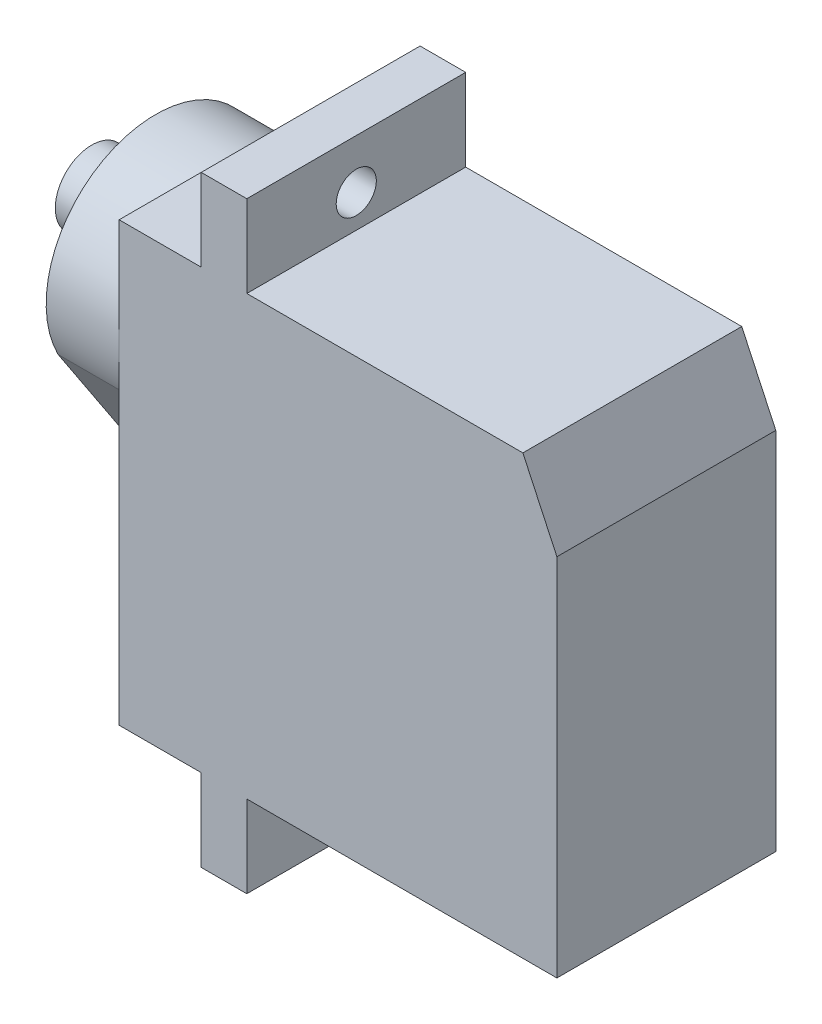
ISO-10303-21;
HEADER;
FILE_DESCRIPTION(('STEP AP214'),'2;1');
FILE_NAME('part.step','',(''),(''),'','','');
FILE_SCHEMA(('AUTOMOTIVE_DESIGN { 1 0 10303 214 1 1 1 1 }'));
ENDSEC;
DATA;
#1=APPLICATION_CONTEXT('core data for automotive mechanical design processes');
#2=APPLICATION_PROTOCOL_DEFINITION('international standard','automotive_design',2000,#1);
#3=PRODUCT_CONTEXT('',#1,'mechanical');
#4=PRODUCT('Part','Part','',(#3));
#5=PRODUCT_RELATED_PRODUCT_CATEGORY('part','',(#4));
#6=PRODUCT_DEFINITION_FORMATION('','',#4);
#7=PRODUCT_DEFINITION_CONTEXT('part definition',#1,'design');
#8=PRODUCT_DEFINITION('design','',#6,#7);
#9=PRODUCT_DEFINITION_SHAPE('','',#8);
#10=(LENGTH_UNIT() NAMED_UNIT(*) SI_UNIT(.MILLI.,.METRE.));
#11=(NAMED_UNIT(*) PLANE_ANGLE_UNIT() SI_UNIT($,.RADIAN.));
#12=(NAMED_UNIT(*) SI_UNIT($,.STERADIAN.) SOLID_ANGLE_UNIT());
#13=UNCERTAINTY_MEASURE_WITH_UNIT(LENGTH_MEASURE(1.E-05),#10,'distance_accuracy_value','');
#14=(GEOMETRIC_REPRESENTATION_CONTEXT(3) GLOBAL_UNCERTAINTY_ASSIGNED_CONTEXT((#13)) GLOBAL_UNIT_ASSIGNED_CONTEXT((#10,
#11,#12)) REPRESENTATION_CONTEXT('',''));
#15=CARTESIAN_POINT('',(0.,0.,0.));
#16=DIRECTION('',(0.,0.,1.));
#17=DIRECTION('',(1.,0.,0.));
#18=AXIS2_PLACEMENT_3D('',#15,#16,#17);
#19=CARTESIAN_POINT('',(-4.,18.,6.));
#20=DIRECTION('',(-1.,0.,0.));
#21=DIRECTION('',(0.,0.,1.));
#22=AXIS2_PLACEMENT_3D('',#19,#20,#21);
#23=PLANE('',#22);
#24=CARTESIAN_POINT('',(-4.,18.,6.));
#25=DIRECTION('',(-1.,0.,0.));
#26=DIRECTION('',(0.,0.,1.));
#27=AXIS2_PLACEMENT_3D('',#24,#25,#26);
#28=CIRCLE('',#27,6.);
#29=CARTESIAN_POINT('',(-4.,15.2788657084899,11.3474693236678));
#30=VERTEX_POINT('',#29);
#31=CARTESIAN_POINT('',(-4.,14.7063447233289,0.984839492253825));
#32=VERTEX_POINT('',#31);
#33=EDGE_CURVE('E176',#30,#32,#28,.T.);
#34=ORIENTED_EDGE('',*,*,#33,.T.);
#35=DIRECTION('',(0.,-0.835860084624362,0.548942546111844));
#36=VECTOR('',#35,1.);
#37=CARTESIAN_POINT('',(-4.,14.7063447233289,0.984839492253825));
#38=LINE('',#37,#36);
#39=CARTESIAN_POINT('',(-4.,8.15403330813783,5.28800287729468));
#40=VERTEX_POINT('',#39);
#41=EDGE_CURVE('E165',#32,#40,#38,.T.);
#42=ORIENTED_EDGE('',*,*,#41,.T.);
#43=CARTESIAN_POINT('',(-4.,8.22321292717812,6.));
#44=DIRECTION('',(-1.,0.,0.));
#45=DIRECTION('',(0.,0.,1.));
#46=AXIS2_PLACEMENT_3D('',#43,#44,#45);
#47=CIRCLE('',#46,0.715350069847776);
#48=CARTESIAN_POINT('',(-4.,8.26267484939339,6.71426079209648));
#49=VERTEX_POINT('',#48);
#50=EDGE_CURVE('E175',#40,#49,#47,.T.);
#51=ORIENTED_EDGE('',*,*,#50,.T.);
#52=DIRECTION('',(0.,0.834471449085261,0.551051177896884));
#53=VECTOR('',#52,1.);
#54=CARTESIAN_POINT('',(-4.,8.26267484939339,6.71426079209648));
#55=LINE('',#54,#53);
#56=EDGE_CURVE('E181',#49,#30,#55,.T.);
#57=ORIENTED_EDGE('',*,*,#56,.T.);
#58=EDGE_LOOP('',(#34,#42,#51,#57));
#59=FACE_BOUND('',#58,.T.);
#60=CARTESIAN_POINT('',(-4.,18.8,6.));
#61=DIRECTION('',(-1.,0.,0.));
#62=DIRECTION('',(0.,0.,1.));
#63=AXIS2_PLACEMENT_3D('',#60,#61,#62);
#64=CIRCLE('',#63,2.);
#65=CARTESIAN_POINT('',(-4.,18.8,8.));
#66=VERTEX_POINT('',#65);
#67=EDGE_CURVE('E313',#66,#66,#64,.T.);
#68=ORIENTED_EDGE('',*,*,#67,.F.);
#69=EDGE_LOOP('',(#68));
#70=FACE_BOUND('',#69,.T.);
#71=ADVANCED_FACE('F37',(#59,#70),#23,.T.);
#72=CARTESIAN_POINT('',(0.,0.,12.));
#73=DIRECTION('',(1.,0.,0.));
#74=DIRECTION('',(0.,0.,-1.));
#75=AXIS2_PLACEMENT_3D('',#72,#73,#74);
#76=PLANE('',#75);
#77=CARTESIAN_POINT('',(0.,18.,6.));
#78=DIRECTION('',(-1.,0.,0.));
#79=DIRECTION('',(0.,0.,1.));
#80=AXIS2_PLACEMENT_3D('',#77,#78,#79);
#81=CIRCLE('',#80,6.);
#82=CARTESIAN_POINT('',(0.,15.2788657084899,11.3474693236678));
#83=VERTEX_POINT('',#82);
#84=CARTESIAN_POINT('',(0.,18.,12.));
#85=VERTEX_POINT('',#84);
#86=EDGE_CURVE('E306',#83,#85,#81,.T.);
#87=ORIENTED_EDGE('',*,*,#86,.F.);
#88=DIRECTION('',(0.,0.834471449085261,0.551051177896884));
#89=VECTOR('',#88,1.);
#90=CARTESIAN_POINT('',(0.,8.26267484939339,6.71426079209648));
#91=LINE('',#90,#89);
#92=CARTESIAN_POINT('',(0.,8.26267484939339,6.71426079209648));
#93=VERTEX_POINT('',#92);
#94=EDGE_CURVE('E185',#93,#83,#91,.T.);
#95=ORIENTED_EDGE('',*,*,#94,.F.);
#96=CARTESIAN_POINT('',(0.,8.22321292717812,6.));
#97=DIRECTION('',(-1.,0.,0.));
#98=DIRECTION('',(0.,0.,1.));
#99=AXIS2_PLACEMENT_3D('',#96,#97,#98);
#100=CIRCLE('',#99,0.715350069847776);
#101=CARTESIAN_POINT('',(0.,8.15403330813783,5.28800287729468));
#102=VERTEX_POINT('',#101);
#103=EDGE_CURVE('E311',#102,#93,#100,.T.);
#104=ORIENTED_EDGE('',*,*,#103,.F.);
#105=DIRECTION('',(0.,-0.835860084624362,0.548942546111844));
#106=VECTOR('',#105,1.);
#107=CARTESIAN_POINT('',(0.,14.7063447233289,0.984839492253825));
#108=LINE('',#107,#106);
#109=CARTESIAN_POINT('',(0.,14.7063447233289,0.984839492253825));
#110=VERTEX_POINT('',#109);
#111=EDGE_CURVE('E309',#110,#102,#108,.T.);
#112=ORIENTED_EDGE('',*,*,#111,.F.);
#113=CARTESIAN_POINT('',(0.,18.,0.));
#114=VERTEX_POINT('',#113);
#115=EDGE_CURVE('E191',#114,#110,#81,.T.);
#116=ORIENTED_EDGE('',*,*,#115,.F.);
#117=DIRECTION('',(0.,-1.,0.));
#118=VECTOR('',#117,1.);
#119=CARTESIAN_POINT('',(0.,0.,0.));
#120=LINE('',#119,#118);
#121=CARTESIAN_POINT('',(0.,0.,0.));
#122=VERTEX_POINT('',#121);
#123=EDGE_CURVE('E207',#114,#122,#120,.T.);
#124=ORIENTED_EDGE('',*,*,#123,.T.);
#125=DIRECTION('',(0.,0.,-1.));
#126=VECTOR('',#125,1.);
#127=CARTESIAN_POINT('',(0.,0.,12.));
#128=LINE('',#127,#126);
#129=CARTESIAN_POINT('',(0.,0.,12.));
#130=VERTEX_POINT('',#129);
#131=EDGE_CURVE('E291',#130,#122,#128,.T.);
#132=ORIENTED_EDGE('',*,*,#131,.F.);
#133=DIRECTION('',(0.,-1.,0.));
#134=VECTOR('',#133,1.);
#135=CARTESIAN_POINT('',(0.,0.,12.));
#136=LINE('',#135,#134);
#137=EDGE_CURVE('E212',#85,#130,#136,.T.);
#138=ORIENTED_EDGE('',*,*,#137,.F.);
#139=EDGE_LOOP('',(#87,#95,#104,#112,#116,#124,#132,#138));
#140=FACE_BOUND('',#139,.T.);
#141=ADVANCED_FACE('F333',(#140),#76,.F.);
#142=CARTESIAN_POINT('',(0.,24.,6.));
#143=VERTEX_POINT('',#142);
#144=EDGE_CURVE('E299',#85,#143,#81,.T.);
#145=ORIENTED_EDGE('',*,*,#144,.F.);
#146=CARTESIAN_POINT('',(0.,24.,12.));
#147=VERTEX_POINT('',#146);
#148=EDGE_CURVE('E208',#147,#85,#136,.T.);
#149=ORIENTED_EDGE('',*,*,#148,.F.);
#150=DIRECTION('',(0.,0.,-1.));
#151=VECTOR('',#150,1.);
#152=CARTESIAN_POINT('',(0.,24.,12.));
#153=LINE('',#152,#151);
#154=EDGE_CURVE('E261',#147,#143,#153,.T.);
#155=ORIENTED_EDGE('',*,*,#154,.T.);
#156=EDGE_LOOP('',(#145,#149,#155));
#157=FACE_BOUND('',#156,.T.);
#158=ADVANCED_FACE('F343',(#157),#76,.F.);
#159=EDGE_CURVE('E304',#143,#114,#81,.T.);
#160=ORIENTED_EDGE('',*,*,#159,.F.);
#161=CARTESIAN_POINT('',(0.,24.,0.));
#162=VERTEX_POINT('',#161);
#163=EDGE_CURVE('E234',#143,#162,#153,.T.);
#164=ORIENTED_EDGE('',*,*,#163,.T.);
#165=EDGE_CURVE('E235',#162,#114,#120,.T.);
#166=ORIENTED_EDGE('',*,*,#165,.T.);
#167=EDGE_LOOP('',(#160,#164,#166));
#168=FACE_BOUND('',#167,.T.);
#169=ADVANCED_FACE('F350',(#168),#76,.F.);
#170=CARTESIAN_POINT('',(0.,0.,12.));
#171=DIRECTION('',(0.,1.,0.));
#172=DIRECTION('',(0.,0.,1.));
#173=AXIS2_PLACEMENT_3D('',#170,#171,#172);
#174=PLANE('',#173);
#175=DIRECTION('',(1.,0.,0.));
#176=VECTOR('',#175,1.);
#177=CARTESIAN_POINT('',(0.,0.,0.));
#178=LINE('',#177,#176);
#179=CARTESIAN_POINT('',(4.5,0.,0.));
#180=VERTEX_POINT('',#179);
#181=EDGE_CURVE('E238',#122,#180,#178,.T.);
#182=ORIENTED_EDGE('',*,*,#181,.T.);
#183=DIRECTION('',(0.,0.,-1.));
#184=VECTOR('',#183,1.);
#185=CARTESIAN_POINT('',(4.5,0.,12.));
#186=LINE('',#185,#184);
#187=CARTESIAN_POINT('',(4.5,0.,12.));
#188=VERTEX_POINT('',#187);
#189=EDGE_CURVE('E288',#188,#180,#186,.T.);
#190=ORIENTED_EDGE('',*,*,#189,.F.);
#191=DIRECTION('',(1.,0.,0.));
#192=VECTOR('',#191,1.);
#193=CARTESIAN_POINT('',(0.,0.,12.));
#194=LINE('',#193,#192);
#195=EDGE_CURVE('E211',#130,#188,#194,.T.);
#196=ORIENTED_EDGE('',*,*,#195,.F.);
#197=ORIENTED_EDGE('',*,*,#131,.T.);
#198=EDGE_LOOP('',(#182,#190,#196,#197));
#199=FACE_BOUND('',#198,.T.);
#200=ADVANCED_FACE('F359',(#199),#174,.F.);
#201=CARTESIAN_POINT('',(4.5,-4.5,12.));
#202=DIRECTION('',(1.,0.,0.));
#203=DIRECTION('',(0.,0.,-1.));
#204=AXIS2_PLACEMENT_3D('',#201,#202,#203);
#205=PLANE('',#204);
#206=CARTESIAN_POINT('',(4.5,-1.80000000000001,6.00000000000001));
#207=DIRECTION('',(-1.,0.,0.));
#208=DIRECTION('',(0.,0.,-1.));
#209=AXIS2_PLACEMENT_3D('',#206,#207,#208);
#210=CIRCLE('',#209,1.1);
#211=CARTESIAN_POINT('',(4.5,-1.80000000000001,4.9));
#212=VERTEX_POINT('',#211);
#213=EDGE_CURVE('E192',#212,#212,#210,.T.);
#214=ORIENTED_EDGE('',*,*,#213,.F.);
#215=EDGE_LOOP('',(#214));
#216=FACE_BOUND('',#215,.T.);
#217=DIRECTION('',(0.,-1.,0.));
#218=VECTOR('',#217,1.);
#219=CARTESIAN_POINT('',(4.5,-4.5,0.));
#220=LINE('',#219,#218);
#221=CARTESIAN_POINT('',(4.5,-4.5,0.));
#222=VERTEX_POINT('',#221);
#223=EDGE_CURVE('E240',#180,#222,#220,.T.);
#224=ORIENTED_EDGE('',*,*,#223,.T.);
#225=DIRECTION('',(0.,0.,-1.));
#226=VECTOR('',#225,1.);
#227=CARTESIAN_POINT('',(4.5,-4.5,12.));
#228=LINE('',#227,#226);
#229=CARTESIAN_POINT('',(4.5,-4.5,12.));
#230=VERTEX_POINT('',#229);
#231=EDGE_CURVE('E285',#230,#222,#228,.T.);
#232=ORIENTED_EDGE('',*,*,#231,.F.);
#233=DIRECTION('',(0.,-1.,0.));
#234=VECTOR('',#233,1.);
#235=CARTESIAN_POINT('',(4.5,-4.5,12.));
#236=LINE('',#235,#234);
#237=EDGE_CURVE('E214',#188,#230,#236,.T.);
#238=ORIENTED_EDGE('',*,*,#237,.F.);
#239=ORIENTED_EDGE('',*,*,#189,.T.);
#240=EDGE_LOOP('',(#224,#232,#238,#239));
#241=FACE_BOUND('',#240,.T.);
#242=ADVANCED_FACE('F365',(#216,#241),#205,.F.);
#243=CARTESIAN_POINT('',(7.,-4.5,12.));
#244=DIRECTION('',(0.,1.,0.));
#245=DIRECTION('',(0.,0.,1.));
#246=AXIS2_PLACEMENT_3D('',#243,#244,#245);
#247=PLANE('',#246);
#248=DIRECTION('',(1.,0.,0.));
#249=VECTOR('',#248,1.);
#250=CARTESIAN_POINT('',(7.,-4.5,0.));
#251=LINE('',#250,#249);
#252=CARTESIAN_POINT('',(7.,-4.5,0.));
#253=VERTEX_POINT('',#252);
#254=EDGE_CURVE('E242',#222,#253,#251,.T.);
#255=ORIENTED_EDGE('',*,*,#254,.T.);
#256=DIRECTION('',(0.,0.,-1.));
#257=VECTOR('',#256,1.);
#258=CARTESIAN_POINT('',(7.,-4.5,12.));
#259=LINE('',#258,#257);
#260=CARTESIAN_POINT('',(7.,-4.5,12.));
#261=VERTEX_POINT('',#260);
#262=EDGE_CURVE('E282',#261,#253,#259,.T.);
#263=ORIENTED_EDGE('',*,*,#262,.F.);
#264=DIRECTION('',(1.,0.,0.));
#265=VECTOR('',#264,1.);
#266=CARTESIAN_POINT('',(7.,-4.5,12.));
#267=LINE('',#266,#265);
#268=EDGE_CURVE('E216',#230,#261,#267,.T.);
#269=ORIENTED_EDGE('',*,*,#268,.F.);
#270=ORIENTED_EDGE('',*,*,#231,.T.);
#271=EDGE_LOOP('',(#255,#263,#269,#270));
#272=FACE_BOUND('',#271,.T.);
#273=ADVANCED_FACE('F367',(#272),#247,.F.);
#274=CARTESIAN_POINT('',(7.,-4.5,12.));
#275=DIRECTION('',(-1.,0.,0.));
#276=DIRECTION('',(0.,0.,1.));
#277=AXIS2_PLACEMENT_3D('',#274,#275,#276);
#278=PLANE('',#277);
#279=CARTESIAN_POINT('',(7.,-1.80000000000001,6.00000000000001));
#280=DIRECTION('',(-1.,0.,0.));
#281=DIRECTION('',(0.,0.,1.));
#282=AXIS2_PLACEMENT_3D('',#279,#280,#281);
#283=CIRCLE('',#282,1.1);
#284=CARTESIAN_POINT('',(7.,-1.80000000000001,7.10000000000001));
#285=VERTEX_POINT('',#284);
#286=EDGE_CURVE('E195',#285,#285,#283,.T.);
#287=ORIENTED_EDGE('',*,*,#286,.T.);
#288=EDGE_LOOP('',(#287));
#289=FACE_BOUND('',#288,.T.);
#290=DIRECTION('',(0.,1.,0.));
#291=VECTOR('',#290,1.);
#292=CARTESIAN_POINT('',(7.,-4.5,0.));
#293=LINE('',#292,#291);
#294=CARTESIAN_POINT('',(7.,0.,0.));
#295=VERTEX_POINT('',#294);
#296=EDGE_CURVE('E244',#253,#295,#293,.T.);
#297=ORIENTED_EDGE('',*,*,#296,.T.);
#298=DIRECTION('',(0.,0.,-1.));
#299=VECTOR('',#298,1.);
#300=CARTESIAN_POINT('',(7.,0.,12.));
#301=LINE('',#300,#299);
#302=CARTESIAN_POINT('',(7.,0.,12.));
#303=VERTEX_POINT('',#302);
#304=EDGE_CURVE('E279',#303,#295,#301,.T.);
#305=ORIENTED_EDGE('',*,*,#304,.F.);
#306=DIRECTION('',(0.,1.,0.));
#307=VECTOR('',#306,1.);
#308=CARTESIAN_POINT('',(7.,-4.5,12.));
#309=LINE('',#308,#307);
#310=EDGE_CURVE('E218',#261,#303,#309,.T.);
#311=ORIENTED_EDGE('',*,*,#310,.F.);
#312=ORIENTED_EDGE('',*,*,#262,.T.);
#313=EDGE_LOOP('',(#297,#305,#311,#312));
#314=FACE_BOUND('',#313,.T.);
#315=ADVANCED_FACE('F372',(#289,#314),#278,.F.);
#316=CARTESIAN_POINT('',(7.,0.,12.));
#317=DIRECTION('',(0.,1.,0.));
#318=DIRECTION('',(0.,0.,1.));
#319=AXIS2_PLACEMENT_3D('',#316,#317,#318);
#320=PLANE('',#319);
#321=DIRECTION('',(1.,0.,0.));
#322=VECTOR('',#321,1.);
#323=CARTESIAN_POINT('',(7.,0.,0.));
#324=LINE('',#323,#322);
#325=CARTESIAN_POINT('',(24.,0.,0.));
#326=VERTEX_POINT('',#325);
#327=EDGE_CURVE('E246',#295,#326,#324,.T.);
#328=ORIENTED_EDGE('',*,*,#327,.T.);
#329=DIRECTION('',(0.,0.,-1.));
#330=VECTOR('',#329,1.);
#331=CARTESIAN_POINT('',(24.,0.,12.));
#332=LINE('',#331,#330);
#333=CARTESIAN_POINT('',(24.,0.,12.));
#334=VERTEX_POINT('',#333);
#335=EDGE_CURVE('E276',#334,#326,#332,.T.);
#336=ORIENTED_EDGE('',*,*,#335,.F.);
#337=DIRECTION('',(1.,0.,0.));
#338=VECTOR('',#337,1.);
#339=CARTESIAN_POINT('',(7.,0.,12.));
#340=LINE('',#339,#338);
#341=EDGE_CURVE('E220',#303,#334,#340,.T.);
#342=ORIENTED_EDGE('',*,*,#341,.F.);
#343=ORIENTED_EDGE('',*,*,#304,.T.);
#344=EDGE_LOOP('',(#328,#336,#342,#343));
#345=FACE_BOUND('',#344,.T.);
#346=ADVANCED_FACE('F377',(#345),#320,.F.);
#347=CARTESIAN_POINT('',(24.,0.,12.));
#348=DIRECTION('',(-1.,0.,0.));
#349=DIRECTION('',(0.,0.,1.));
#350=AXIS2_PLACEMENT_3D('',#347,#348,#349);
#351=PLANE('',#350);
#352=DIRECTION('',(0.,1.,0.));
#353=VECTOR('',#352,1.);
#354=CARTESIAN_POINT('',(24.,0.,0.));
#355=LINE('',#354,#353);
#356=CARTESIAN_POINT('',(24.,20.,0.));
#357=VERTEX_POINT('',#356);
#358=EDGE_CURVE('E248',#326,#357,#355,.T.);
#359=ORIENTED_EDGE('',*,*,#358,.T.);
#360=DIRECTION('',(0.,0.,1.));
#361=VECTOR('',#360,1.);
#362=CARTESIAN_POINT('',(24.,20.,12.));
#363=LINE('',#362,#361);
#364=CARTESIAN_POINT('',(24.,20.,12.));
#365=VERTEX_POINT('',#364);
#366=EDGE_CURVE('E45',#357,#365,#363,.T.);
#367=ORIENTED_EDGE('',*,*,#366,.T.);
#368=DIRECTION('',(0.,1.,0.));
#369=VECTOR('',#368,1.);
#370=CARTESIAN_POINT('',(24.,0.,12.));
#371=LINE('',#370,#369);
#372=EDGE_CURVE('E222',#334,#365,#371,.T.);
#373=ORIENTED_EDGE('',*,*,#372,.F.);
#374=ORIENTED_EDGE('',*,*,#335,.T.);
#375=EDGE_LOOP('',(#359,#367,#373,#374));
#376=FACE_BOUND('',#375,.T.);
#377=ADVANCED_FACE('F379',(#376),#351,.F.);
#378=CARTESIAN_POINT('',(7.,24.,12.));
#379=DIRECTION('',(0.,-1.,0.));
#380=DIRECTION('',(0.,0.,-1.));
#381=AXIS2_PLACEMENT_3D('',#378,#379,#380);
#382=PLANE('',#381);
#383=DIRECTION('',(-1.,0.,0.));
#384=VECTOR('',#383,1.);
#385=CARTESIAN_POINT('',(7.,24.,12.));
#386=LINE('',#385,#384);
#387=CARTESIAN_POINT('',(22.13476936738,24.,12.));
#388=VERTEX_POINT('',#387);
#389=CARTESIAN_POINT('',(7.,24.,12.));
#390=VERTEX_POINT('',#389);
#391=EDGE_CURVE('E224',#388,#390,#386,.T.);
#392=ORIENTED_EDGE('',*,*,#391,.F.);
#393=DIRECTION('',(0.,0.,-1.));
#394=VECTOR('',#393,1.);
#395=CARTESIAN_POINT('',(22.13476936738,24.,12.));
#396=LINE('',#395,#394);
#397=CARTESIAN_POINT('',(22.13476936738,24.,0.));
#398=VERTEX_POINT('',#397);
#399=EDGE_CURVE('E296',#388,#398,#396,.T.);
#400=ORIENTED_EDGE('',*,*,#399,.T.);
#401=DIRECTION('',(-1.,0.,0.));
#402=VECTOR('',#401,1.);
#403=CARTESIAN_POINT('',(7.,24.,0.));
#404=LINE('',#403,#402);
#405=CARTESIAN_POINT('',(7.,24.,0.));
#406=VERTEX_POINT('',#405);
#407=EDGE_CURVE('E250',#398,#406,#404,.T.);
#408=ORIENTED_EDGE('',*,*,#407,.T.);
#409=DIRECTION('',(0.,0.,-1.));
#410=VECTOR('',#409,1.);
#411=CARTESIAN_POINT('',(7.,24.,12.));
#412=LINE('',#411,#410);
#413=EDGE_CURVE('E273',#390,#406,#412,.T.);
#414=ORIENTED_EDGE('',*,*,#413,.F.);
#415=EDGE_LOOP('',(#392,#400,#408,#414));
#416=FACE_BOUND('',#415,.T.);
#417=ADVANCED_FACE('F381',(#416),#382,.F.);
#418=CARTESIAN_POINT('',(7.,24.,12.));
#419=DIRECTION('',(-1.,0.,0.));
#420=DIRECTION('',(0.,0.,1.));
#421=AXIS2_PLACEMENT_3D('',#418,#419,#420);
#422=PLANE('',#421);
#423=CARTESIAN_POINT('',(7.,25.8,6.));
#424=DIRECTION('',(-1.,0.,0.));
#425=DIRECTION('',(0.,0.,1.));
#426=AXIS2_PLACEMENT_3D('',#423,#424,#425);
#427=CIRCLE('',#426,1.1);
#428=CARTESIAN_POINT('',(7.,25.8,7.1));
#429=VERTEX_POINT('',#428);
#430=EDGE_CURVE('E204',#429,#429,#427,.T.);
#431=ORIENTED_EDGE('',*,*,#430,.T.);
#432=EDGE_LOOP('',(#431));
#433=FACE_BOUND('',#432,.T.);
#434=DIRECTION('',(0.,1.,0.));
#435=VECTOR('',#434,1.);
#436=CARTESIAN_POINT('',(7.,24.,0.));
#437=LINE('',#436,#435);
#438=CARTESIAN_POINT('',(7.,28.5,0.));
#439=VERTEX_POINT('',#438);
#440=EDGE_CURVE('E252',#406,#439,#437,.T.);
#441=ORIENTED_EDGE('',*,*,#440,.T.);
#442=DIRECTION('',(0.,0.,-1.));
#443=VECTOR('',#442,1.);
#444=CARTESIAN_POINT('',(7.,28.5,12.));
#445=LINE('',#444,#443);
#446=CARTESIAN_POINT('',(7.,28.5,12.));
#447=VERTEX_POINT('',#446);
#448=EDGE_CURVE('E270',#447,#439,#445,.T.);
#449=ORIENTED_EDGE('',*,*,#448,.F.);
#450=DIRECTION('',(0.,1.,0.));
#451=VECTOR('',#450,1.);
#452=CARTESIAN_POINT('',(7.,24.,12.));
#453=LINE('',#452,#451);
#454=EDGE_CURVE('E226',#390,#447,#453,.T.);
#455=ORIENTED_EDGE('',*,*,#454,.F.);
#456=ORIENTED_EDGE('',*,*,#413,.T.);
#457=EDGE_LOOP('',(#441,#449,#455,#456));
#458=FACE_BOUND('',#457,.T.);
#459=ADVANCED_FACE('F387',(#433,#458),#422,.F.);
#460=CARTESIAN_POINT('',(7.,28.5,12.));
#461=DIRECTION('',(0.,-1.,0.));
#462=DIRECTION('',(0.,0.,-1.));
#463=AXIS2_PLACEMENT_3D('',#460,#461,#462);
#464=PLANE('',#463);
#465=DIRECTION('',(-1.,0.,0.));
#466=VECTOR('',#465,1.);
#467=CARTESIAN_POINT('',(7.,28.5,0.));
#468=LINE('',#467,#466);
#469=CARTESIAN_POINT('',(4.5,28.5,0.));
#470=VERTEX_POINT('',#469);
#471=EDGE_CURVE('E254',#439,#470,#468,.T.);
#472=ORIENTED_EDGE('',*,*,#471,.T.);
#473=DIRECTION('',(0.,0.,-1.));
#474=VECTOR('',#473,1.);
#475=CARTESIAN_POINT('',(4.5,28.5,12.));
#476=LINE('',#475,#474);
#477=CARTESIAN_POINT('',(4.5,28.5,12.));
#478=VERTEX_POINT('',#477);
#479=EDGE_CURVE('E267',#478,#470,#476,.T.);
#480=ORIENTED_EDGE('',*,*,#479,.F.);
#481=DIRECTION('',(-1.,0.,0.));
#482=VECTOR('',#481,1.);
#483=CARTESIAN_POINT('',(7.,28.5,12.));
#484=LINE('',#483,#482);
#485=EDGE_CURVE('E228',#447,#478,#484,.T.);
#486=ORIENTED_EDGE('',*,*,#485,.F.);
#487=ORIENTED_EDGE('',*,*,#448,.T.);
#488=EDGE_LOOP('',(#472,#480,#486,#487));
#489=FACE_BOUND('',#488,.T.);
#490=ADVANCED_FACE('F424',(#489),#464,.F.);
#491=CARTESIAN_POINT('',(4.5,24.,12.));
#492=DIRECTION('',(1.,0.,0.));
#493=DIRECTION('',(0.,0.,-1.));
#494=AXIS2_PLACEMENT_3D('',#491,#492,#493);
#495=PLANE('',#494);
#496=CARTESIAN_POINT('',(4.5,25.8,6.));
#497=DIRECTION('',(-1.,0.,0.));
#498=DIRECTION('',(0.,0.,1.));
#499=AXIS2_PLACEMENT_3D('',#496,#497,#498);
#500=CIRCLE('',#499,1.1);
#501=CARTESIAN_POINT('',(4.5,25.8,7.1));
#502=VERTEX_POINT('',#501);
#503=EDGE_CURVE('E201',#502,#502,#500,.T.);
#504=ORIENTED_EDGE('',*,*,#503,.F.);
#505=EDGE_LOOP('',(#504));
#506=FACE_BOUND('',#505,.T.);
#507=DIRECTION('',(0.,-1.,0.));
#508=VECTOR('',#507,1.);
#509=CARTESIAN_POINT('',(4.5,24.,0.));
#510=LINE('',#509,#508);
#511=CARTESIAN_POINT('',(4.5,24.,0.));
#512=VERTEX_POINT('',#511);
#513=EDGE_CURVE('E256',#470,#512,#510,.T.);
#514=ORIENTED_EDGE('',*,*,#513,.T.);
#515=DIRECTION('',(0.,0.,-1.));
#516=VECTOR('',#515,1.);
#517=CARTESIAN_POINT('',(4.5,24.,12.));
#518=LINE('',#517,#516);
#519=CARTESIAN_POINT('',(4.5,24.,12.));
#520=VERTEX_POINT('',#519);
#521=EDGE_CURVE('E264',#520,#512,#518,.T.);
#522=ORIENTED_EDGE('',*,*,#521,.F.);
#523=DIRECTION('',(0.,-1.,0.));
#524=VECTOR('',#523,1.);
#525=CARTESIAN_POINT('',(4.5,24.,12.));
#526=LINE('',#525,#524);
#527=EDGE_CURVE('E230',#478,#520,#526,.T.);
#528=ORIENTED_EDGE('',*,*,#527,.F.);
#529=ORIENTED_EDGE('',*,*,#479,.T.);
#530=EDGE_LOOP('',(#514,#522,#528,#529));
#531=FACE_BOUND('',#530,.T.);
#532=ADVANCED_FACE('F421',(#506,#531),#495,.F.);
#533=CARTESIAN_POINT('',(0.,24.,12.));
#534=DIRECTION('',(0.,-1.,0.));
#535=DIRECTION('',(0.,0.,-1.));
#536=AXIS2_PLACEMENT_3D('',#533,#534,#535);
#537=PLANE('',#536);
#538=DIRECTION('',(-1.,0.,0.));
#539=VECTOR('',#538,1.);
#540=CARTESIAN_POINT('',(0.,24.,0.));
#541=LINE('',#540,#539);
#542=EDGE_CURVE('E258',#512,#162,#541,.T.);
#543=ORIENTED_EDGE('',*,*,#542,.T.);
#544=ORIENTED_EDGE('',*,*,#163,.F.);
#545=ORIENTED_EDGE('',*,*,#154,.F.);
#546=DIRECTION('',(-1.,0.,0.));
#547=VECTOR('',#546,1.);
#548=CARTESIAN_POINT('',(0.,24.,12.));
#549=LINE('',#548,#547);
#550=EDGE_CURVE('E232',#520,#147,#549,.T.);
#551=ORIENTED_EDGE('',*,*,#550,.F.);
#552=ORIENTED_EDGE('',*,*,#521,.T.);
#553=EDGE_LOOP('',(#543,#544,#545,#551,#552));
#554=FACE_BOUND('',#553,.T.);
#555=ADVANCED_FACE('F346',(#554),#537,.F.);
#556=CARTESIAN_POINT('',(0.,0.,12.));
#557=DIRECTION('',(0.,0.,-1.));
#558=DIRECTION('',(-1.,0.,0.));
#559=AXIS2_PLACEMENT_3D('',#556,#557,#558);
#560=PLANE('',#559);
#561=ORIENTED_EDGE('',*,*,#372,.T.);
#562=DIRECTION('',(0.422618261740697,-0.906307787036651,0.));
#563=VECTOR('',#562,1.);
#564=CARTESIAN_POINT('',(22.13476936738,24.,12.));
#565=LINE('',#564,#563);
#566=EDGE_CURVE('E11',#365,#388,#565,.F.);
#567=ORIENTED_EDGE('',*,*,#566,.T.);
#568=ORIENTED_EDGE('',*,*,#391,.T.);
#569=ORIENTED_EDGE('',*,*,#454,.T.);
#570=ORIENTED_EDGE('',*,*,#485,.T.);
#571=ORIENTED_EDGE('',*,*,#527,.T.);
#572=ORIENTED_EDGE('',*,*,#550,.T.);
#573=ORIENTED_EDGE('',*,*,#148,.T.);
#574=ORIENTED_EDGE('',*,*,#137,.T.);
#575=ORIENTED_EDGE('',*,*,#195,.T.);
#576=ORIENTED_EDGE('',*,*,#237,.T.);
#577=ORIENTED_EDGE('',*,*,#268,.T.);
#578=ORIENTED_EDGE('',*,*,#310,.T.);
#579=ORIENTED_EDGE('',*,*,#341,.T.);
#580=EDGE_LOOP('',(#561,#567,#568,#569,#570,#571,#572,#573,#574,#575,#576,#577,#578,#579));
#581=FACE_BOUND('',#580,.T.);
#582=ADVANCED_FACE('F339',(#581),#560,.F.);
#583=CARTESIAN_POINT('',(0.,0.,0.));
#584=DIRECTION('',(0.,0.,-1.));
#585=DIRECTION('',(-1.,0.,0.));
#586=AXIS2_PLACEMENT_3D('',#583,#584,#585);
#587=PLANE('',#586);
#588=ORIENTED_EDGE('',*,*,#407,.F.);
#589=DIRECTION('',(-0.422618261740697,0.906307787036651,0.));
#590=VECTOR('',#589,1.);
#591=CARTESIAN_POINT('',(27.3738957474282,12.7646572205623,0.));
#592=LINE('',#591,#590);
#593=EDGE_CURVE('E59',#398,#357,#592,.F.);
#594=ORIENTED_EDGE('',*,*,#593,.T.);
#595=ORIENTED_EDGE('',*,*,#358,.F.);
#596=ORIENTED_EDGE('',*,*,#327,.F.);
#597=ORIENTED_EDGE('',*,*,#296,.F.);
#598=ORIENTED_EDGE('',*,*,#254,.F.);
#599=ORIENTED_EDGE('',*,*,#223,.F.);
#600=ORIENTED_EDGE('',*,*,#181,.F.);
#601=ORIENTED_EDGE('',*,*,#123,.F.);
#602=ORIENTED_EDGE('',*,*,#165,.F.);
#603=ORIENTED_EDGE('',*,*,#542,.F.);
#604=ORIENTED_EDGE('',*,*,#513,.F.);
#605=ORIENTED_EDGE('',*,*,#471,.F.);
#606=ORIENTED_EDGE('',*,*,#440,.F.);
#607=EDGE_LOOP('',(#588,#594,#595,#596,#597,#598,#599,#600,#601,#602,#603,#604,#605,#606));
#608=FACE_BOUND('',#607,.T.);
#609=ADVANCED_FACE('F352',(#608),#587,.T.);
#610=CARTESIAN_POINT('',(24.,25.8,6.));
#611=DIRECTION('',(-1.,0.,0.));
#612=DIRECTION('',(0.,0.,1.));
#613=AXIS2_PLACEMENT_3D('',#610,#611,#612);
#614=CYLINDRICAL_SURFACE('',#613,1.1);
#615=ORIENTED_EDGE('',*,*,#503,.T.);
#616=EDGE_LOOP('',(#615));
#617=FACE_BOUND('',#616,.T.);
#618=ORIENTED_EDGE('',*,*,#430,.F.);
#619=EDGE_LOOP('',(#618));
#620=FACE_BOUND('',#619,.T.);
#621=ADVANCED_FACE('F410',(#617,#620),#614,.F.);
#622=CARTESIAN_POINT('',(24.,-1.80000000000001,6.00000000000001));
#623=DIRECTION('',(-1.,0.,0.));
#624=DIRECTION('',(0.,0.,1.));
#625=AXIS2_PLACEMENT_3D('',#622,#623,#624);
#626=CYLINDRICAL_SURFACE('',#625,1.1);
#627=ORIENTED_EDGE('',*,*,#213,.T.);
#628=EDGE_LOOP('',(#627));
#629=FACE_BOUND('',#628,.T.);
#630=ORIENTED_EDGE('',*,*,#286,.F.);
#631=EDGE_LOOP('',(#630));
#632=FACE_BOUND('',#631,.T.);
#633=ADVANCED_FACE('F407',(#629,#632),#626,.F.);
#634=CARTESIAN_POINT('',(-4.,18.,6.));
#635=DIRECTION('',(1.,0.,0.));
#636=DIRECTION('',(0.,0.,-1.));
#637=AXIS2_PLACEMENT_3D('',#634,#635,#636);
#638=CYLINDRICAL_SURFACE('',#637,6.);
#639=ORIENTED_EDGE('',*,*,#86,.T.);
#640=ORIENTED_EDGE('',*,*,#144,.T.);
#641=ORIENTED_EDGE('',*,*,#159,.T.);
#642=ORIENTED_EDGE('',*,*,#115,.T.);
#643=DIRECTION('',(1.,0.,0.));
#644=VECTOR('',#643,1.);
#645=CARTESIAN_POINT('',(-4.,14.7063447233289,0.984839492253825));
#646=LINE('',#645,#644);
#647=EDGE_CURVE('E170',#32,#110,#646,.T.);
#648=ORIENTED_EDGE('',*,*,#647,.F.);
#649=ORIENTED_EDGE('',*,*,#33,.F.);
#650=DIRECTION('',(1.,0.,0.));
#651=VECTOR('',#650,1.);
#652=CARTESIAN_POINT('',(-4.,15.2788657084899,11.3474693236678));
#653=LINE('',#652,#651);
#654=EDGE_CURVE('E320',#30,#83,#653,.T.);
#655=ORIENTED_EDGE('',*,*,#654,.T.);
#656=EDGE_LOOP('',(#639,#640,#641,#642,#648,#649,#655));
#657=FACE_BOUND('',#656,.T.);
#658=ADVANCED_FACE('F189',(#657),#638,.T.);
#659=CARTESIAN_POINT('',(-4.,14.7063447233289,0.984839492253825));
#660=DIRECTION('',(0.,0.548942546111844,0.835860084624362));
#661=DIRECTION('',(0.,-0.835860084624362,0.548942546111844));
#662=AXIS2_PLACEMENT_3D('',#659,#660,#661);
#663=PLANE('',#662);
#664=ORIENTED_EDGE('',*,*,#111,.T.);
#665=DIRECTION('',(1.,0.,0.));
#666=VECTOR('',#665,1.);
#667=CARTESIAN_POINT('',(-4.,8.15403330813783,5.28800287729468));
#668=LINE('',#667,#666);
#669=EDGE_CURVE('E172',#40,#102,#668,.T.);
#670=ORIENTED_EDGE('',*,*,#669,.F.);
#671=ORIENTED_EDGE('',*,*,#41,.F.);
#672=ORIENTED_EDGE('',*,*,#647,.T.);
#673=EDGE_LOOP('',(#664,#670,#671,#672));
#674=FACE_BOUND('',#673,.T.);
#675=ADVANCED_FACE('F168',(#674),#663,.F.);
#676=CARTESIAN_POINT('',(-4.,8.22321292717812,6.));
#677=DIRECTION('',(1.,0.,0.));
#678=DIRECTION('',(0.,0.,-1.));
#679=AXIS2_PLACEMENT_3D('',#676,#677,#678);
#680=CYLINDRICAL_SURFACE('',#679,0.715350069847776);
#681=ORIENTED_EDGE('',*,*,#103,.T.);
#682=DIRECTION('',(1.,0.,0.));
#683=VECTOR('',#682,1.);
#684=CARTESIAN_POINT('',(-4.,8.26267484939339,6.71426079209648));
#685=LINE('',#684,#683);
#686=EDGE_CURVE('E197',#49,#93,#685,.T.);
#687=ORIENTED_EDGE('',*,*,#686,.F.);
#688=ORIENTED_EDGE('',*,*,#50,.F.);
#689=ORIENTED_EDGE('',*,*,#669,.T.);
#690=EDGE_LOOP('',(#681,#687,#688,#689));
#691=FACE_BOUND('',#690,.T.);
#692=ADVANCED_FACE('F329',(#691),#680,.T.);
#693=CARTESIAN_POINT('',(-4.,8.26267484939339,6.71426079209648));
#694=DIRECTION('',(0.,0.551051177896884,-0.834471449085262));
#695=DIRECTION('',(0.,0.834471449085262,0.551051177896884));
#696=AXIS2_PLACEMENT_3D('',#693,#694,#695);
#697=PLANE('',#696);
#698=ORIENTED_EDGE('',*,*,#94,.T.);
#699=ORIENTED_EDGE('',*,*,#654,.F.);
#700=ORIENTED_EDGE('',*,*,#56,.F.);
#701=ORIENTED_EDGE('',*,*,#686,.T.);
#702=EDGE_LOOP('',(#698,#699,#700,#701));
#703=FACE_BOUND('',#702,.T.);
#704=ADVANCED_FACE('F332',(#703),#697,.F.);
#705=CARTESIAN_POINT('',(-7.5,18.8,6.));
#706=DIRECTION('',(1.,0.,0.));
#707=DIRECTION('',(0.,0.,-1.));
#708=AXIS2_PLACEMENT_3D('',#705,#706,#707);
#709=CYLINDRICAL_SURFACE('',#708,2.);
#710=CARTESIAN_POINT('',(-7.5,18.8,6.));
#711=DIRECTION('',(-1.,0.,0.));
#712=DIRECTION('',(0.,0.,1.));
#713=AXIS2_PLACEMENT_3D('',#710,#711,#712);
#714=CIRCLE('',#713,2.);
#715=CARTESIAN_POINT('',(-7.5,18.8,8.));
#716=VERTEX_POINT('',#715);
#717=EDGE_CURVE('E310',#716,#716,#714,.T.);
#718=ORIENTED_EDGE('',*,*,#717,.F.);
#719=EDGE_LOOP('',(#718));
#720=FACE_BOUND('',#719,.T.);
#721=ORIENTED_EDGE('',*,*,#67,.T.);
#722=EDGE_LOOP('',(#721));
#723=FACE_BOUND('',#722,.T.);
#724=ADVANCED_FACE('F397',(#720,#723),#709,.T.);
#725=CARTESIAN_POINT('',(-7.5,18.8,6.));
#726=DIRECTION('',(-1.,0.,0.));
#727=DIRECTION('',(0.,0.,1.));
#728=AXIS2_PLACEMENT_3D('',#725,#726,#727);
#729=PLANE('',#728);
#730=ORIENTED_EDGE('',*,*,#717,.T.);
#731=EDGE_LOOP('',(#730));
#732=FACE_BOUND('',#731,.T.);
#733=ADVANCED_FACE('F447',(#732),#729,.T.);
#734=CARTESIAN_POINT('',(22.13476936738,24.,12.));
#735=DIRECTION('',(-0.906307787036651,-0.422618261740697,0.));
#736=DIRECTION('',(0.,0.,-1.));
#737=AXIS2_PLACEMENT_3D('',#734,#735,#736);
#738=PLANE('',#737);
#739=ORIENTED_EDGE('',*,*,#566,.F.);
#740=ORIENTED_EDGE('',*,*,#366,.F.);
#741=ORIENTED_EDGE('',*,*,#593,.F.);
#742=ORIENTED_EDGE('',*,*,#399,.F.);
#743=EDGE_LOOP('',(#739,#740,#741,#742));
#744=FACE_BOUND('',#743,.T.);
#745=ADVANCED_FACE('F39',(#744),#738,.F.);
#746=CLOSED_SHELL('',(#71,#141,#158,#169,#200,#242,#273,#315,#346,#377,#417,#459,#490,#532,#555,
#582,#609,#621,#633,#658,#675,#692,#704,#724,#733,#745));
#747=MANIFOLD_SOLID_BREP('B2',#746);
#748=ADVANCED_BREP_SHAPE_REPRESENTATION('',(#18,#747),#14);
#749=SHAPE_DEFINITION_REPRESENTATION(#9,#748);
ENDSEC;
END-ISO-10303-21;
